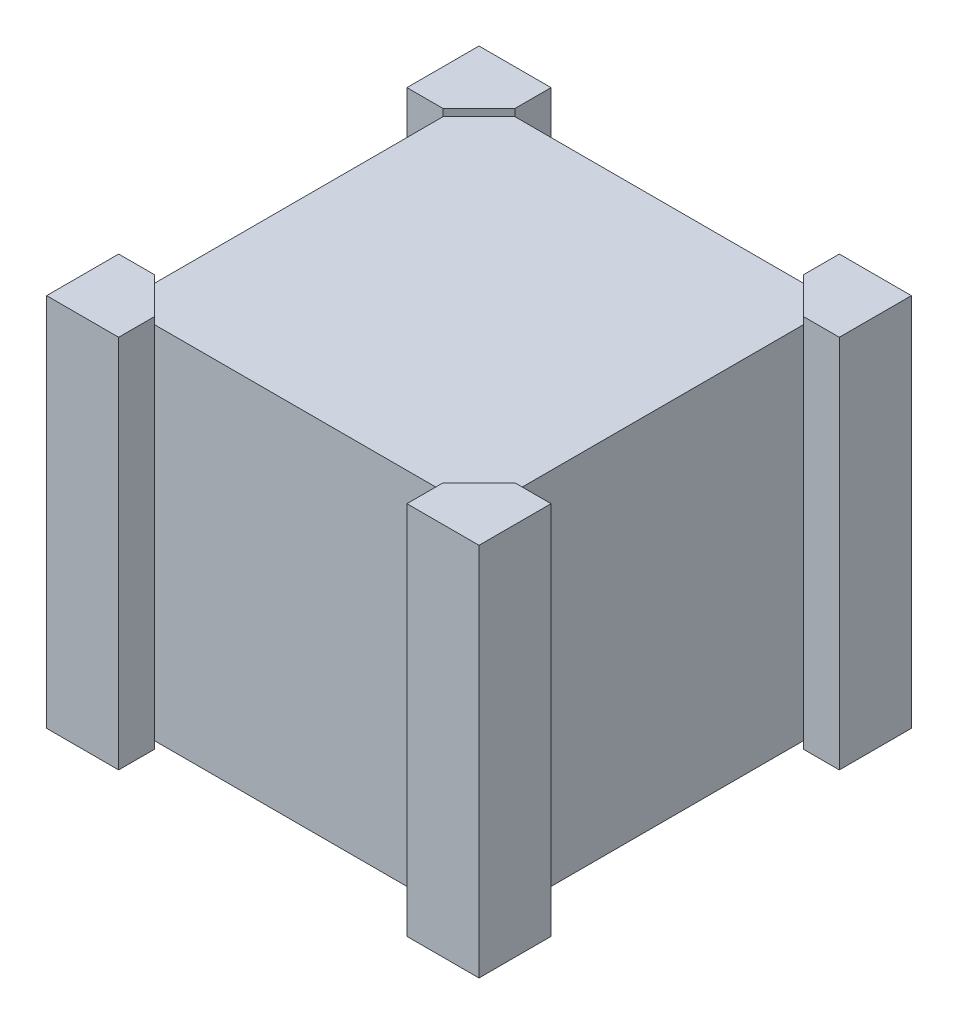
ISO-10303-21;
HEADER;
FILE_DESCRIPTION(('STEP AP214'),'2;1');
FILE_NAME('part.step','',(''),(''),'','','');
FILE_SCHEMA(('AUTOMOTIVE_DESIGN { 1 0 10303 214 1 1 1 1 }'));
ENDSEC;
DATA;
#1=APPLICATION_CONTEXT('core data for automotive mechanical design processes');
#2=APPLICATION_PROTOCOL_DEFINITION('international standard','automotive_design',2000,#1);
#3=PRODUCT_CONTEXT('',#1,'mechanical');
#4=PRODUCT('Part','Part','',(#3));
#5=PRODUCT_RELATED_PRODUCT_CATEGORY('part','',(#4));
#6=PRODUCT_DEFINITION_FORMATION('','',#4);
#7=PRODUCT_DEFINITION_CONTEXT('part definition',#1,'design');
#8=PRODUCT_DEFINITION('design','',#6,#7);
#9=PRODUCT_DEFINITION_SHAPE('','',#8);
#10=(LENGTH_UNIT() NAMED_UNIT(*) SI_UNIT(.MILLI.,.METRE.));
#11=(NAMED_UNIT(*) PLANE_ANGLE_UNIT() SI_UNIT($,.RADIAN.));
#12=(NAMED_UNIT(*) SI_UNIT($,.STERADIAN.) SOLID_ANGLE_UNIT());
#13=UNCERTAINTY_MEASURE_WITH_UNIT(LENGTH_MEASURE(1.E-05),#10,'distance_accuracy_value','');
#14=(GEOMETRIC_REPRESENTATION_CONTEXT(3) GLOBAL_UNCERTAINTY_ASSIGNED_CONTEXT((#13)) GLOBAL_UNIT_ASSIGNED_CONTEXT((#10,
#11,#12)) REPRESENTATION_CONTEXT('',''));
#15=CARTESIAN_POINT('',(0.,0.,0.));
#16=DIRECTION('',(0.,0.,1.));
#17=DIRECTION('',(1.,0.,0.));
#18=AXIS2_PLACEMENT_3D('',#15,#16,#17);
#19=CARTESIAN_POINT('',(0.,127.,0.));
#20=DIRECTION('',(0.,1.,0.));
#21=DIRECTION('',(0.,0.,1.));
#22=AXIS2_PLACEMENT_3D('',#19,#20,#21);
#23=PLANE('',#22);
#24=DIRECTION('',(0.707106781186549,0.,0.707106781186546));
#25=VECTOR('',#24,1.);
#26=CARTESIAN_POINT('',(-57.1499999999998,127.,57.1500000000001));
#27=LINE('',#26,#25);
#28=CARTESIAN_POINT('',(-63.5,127.,50.8));
#29=VERTEX_POINT('',#28);
#30=CARTESIAN_POINT('',(-50.8,127.,63.5));
#31=VERTEX_POINT('',#30);
#32=EDGE_CURVE('E268',#29,#31,#27,.T.);
#33=ORIENTED_EDGE('',*,*,#32,.T.);
#34=DIRECTION('',(1.,0.,0.));
#35=VECTOR('',#34,1.);
#36=CARTESIAN_POINT('',(0.,127.,63.5));
#37=LINE('',#36,#35);
#38=CARTESIAN_POINT('',(50.8,127.,63.5));
#39=VERTEX_POINT('',#38);
#40=EDGE_CURVE('E510',#31,#39,#37,.T.);
#41=ORIENTED_EDGE('',*,*,#40,.T.);
#42=DIRECTION('',(0.707106781186548,0.,-0.707106781186547));
#43=VECTOR('',#42,1.);
#44=CARTESIAN_POINT('',(57.15,127.,57.1500000000001));
#45=LINE('',#44,#43);
#46=CARTESIAN_POINT('',(63.5,127.,50.8));
#47=VERTEX_POINT('',#46);
#48=EDGE_CURVE('E355',#39,#47,#45,.T.);
#49=ORIENTED_EDGE('',*,*,#48,.T.);
#50=DIRECTION('',(0.,0.,1.));
#51=VECTOR('',#50,1.);
#52=CARTESIAN_POINT('',(63.5,127.,0.));
#53=LINE('',#52,#51);
#54=CARTESIAN_POINT('',(63.5,127.,-50.8));
#55=VERTEX_POINT('',#54);
#56=EDGE_CURVE('E499',#55,#47,#53,.T.);
#57=ORIENTED_EDGE('',*,*,#56,.F.);
#58=DIRECTION('',(-0.707106781186546,0.,-0.707106781186549));
#59=VECTOR('',#58,1.);
#60=CARTESIAN_POINT('',(57.1500000000002,127.,-57.1499999999998));
#61=LINE('',#60,#59);
#62=CARTESIAN_POINT('',(50.8,127.,-63.5));
#63=VERTEX_POINT('',#62);
#64=EDGE_CURVE('E323',#55,#63,#61,.T.);
#65=ORIENTED_EDGE('',*,*,#64,.T.);
#66=DIRECTION('',(1.,0.,0.));
#67=VECTOR('',#66,1.);
#68=CARTESIAN_POINT('',(0.,127.,-63.5));
#69=LINE('',#68,#67);
#70=CARTESIAN_POINT('',(-50.8,127.,-63.5));
#71=VERTEX_POINT('',#70);
#72=EDGE_CURVE('E502',#71,#63,#69,.T.);
#73=ORIENTED_EDGE('',*,*,#72,.F.);
#74=DIRECTION('',(0.707106781186548,0.,-0.707106781186547));
#75=VECTOR('',#74,1.);
#76=CARTESIAN_POINT('',(-57.15,127.,-57.15));
#77=LINE('',#76,#75);
#78=CARTESIAN_POINT('',(-63.5,127.,-50.8));
#79=VERTEX_POINT('',#78);
#80=EDGE_CURVE('E292',#79,#71,#77,.T.);
#81=ORIENTED_EDGE('',*,*,#80,.F.);
#82=DIRECTION('',(0.,0.,1.));
#83=VECTOR('',#82,1.);
#84=CARTESIAN_POINT('',(-63.5,127.,0.));
#85=LINE('',#84,#83);
#86=EDGE_CURVE('E506',#79,#29,#85,.T.);
#87=ORIENTED_EDGE('',*,*,#86,.T.);
#88=EDGE_LOOP('',(#33,#41,#49,#57,#65,#73,#81,#87));
#89=FACE_BOUND('',#88,.T.);
#90=ADVANCED_FACE('F45',(#89),#23,.T.);
#91=CARTESIAN_POINT('',(0.,0.,0.));
#92=DIRECTION('',(0.,1.,0.));
#93=DIRECTION('',(0.,0.,1.));
#94=AXIS2_PLACEMENT_3D('',#91,#92,#93);
#95=PLANE('',#94);
#96=DIRECTION('',(0.707106781186549,0.,0.707106781186546));
#97=VECTOR('',#96,1.);
#98=CARTESIAN_POINT('',(-57.1499999999998,0.,57.1500000000001));
#99=LINE('',#98,#97);
#100=CARTESIAN_POINT('',(-63.5,0.,50.8));
#101=VERTEX_POINT('',#100);
#102=CARTESIAN_POINT('',(-50.8,0.,63.5));
#103=VERTEX_POINT('',#102);
#104=EDGE_CURVE('E382',#101,#103,#99,.T.);
#105=ORIENTED_EDGE('',*,*,#104,.F.);
#106=DIRECTION('',(0.,0.,1.));
#107=VECTOR('',#106,1.);
#108=CARTESIAN_POINT('',(-63.5,0.,0.));
#109=LINE('',#108,#107);
#110=CARTESIAN_POINT('',(-63.5,0.,-50.8));
#111=VERTEX_POINT('',#110);
#112=EDGE_CURVE('E521',#111,#101,#109,.T.);
#113=ORIENTED_EDGE('',*,*,#112,.F.);
#114=DIRECTION('',(0.707106781186548,0.,-0.707106781186547));
#115=VECTOR('',#114,1.);
#116=CARTESIAN_POINT('',(-57.15,0.,-57.15));
#117=LINE('',#116,#115);
#118=CARTESIAN_POINT('',(-50.8,0.,-63.5));
#119=VERTEX_POINT('',#118);
#120=EDGE_CURVE('E410',#111,#119,#117,.T.);
#121=ORIENTED_EDGE('',*,*,#120,.T.);
#122=DIRECTION('',(1.,0.,0.));
#123=VECTOR('',#122,1.);
#124=CARTESIAN_POINT('',(0.,0.,-63.5));
#125=LINE('',#124,#123);
#126=CARTESIAN_POINT('',(50.8,0.,-63.5));
#127=VERTEX_POINT('',#126);
#128=EDGE_CURVE('E517',#119,#127,#125,.T.);
#129=ORIENTED_EDGE('',*,*,#128,.T.);
#130=DIRECTION('',(-0.707106781186546,0.,-0.707106781186549));
#131=VECTOR('',#130,1.);
#132=CARTESIAN_POINT('',(57.1500000000002,0.,-57.1499999999998));
#133=LINE('',#132,#131);
#134=CARTESIAN_POINT('',(63.5,0.,-50.8));
#135=VERTEX_POINT('',#134);
#136=EDGE_CURVE('E440',#135,#127,#133,.T.);
#137=ORIENTED_EDGE('',*,*,#136,.F.);
#138=DIRECTION('',(0.,0.,1.));
#139=VECTOR('',#138,1.);
#140=CARTESIAN_POINT('',(63.5,0.,0.));
#141=LINE('',#140,#139);
#142=CARTESIAN_POINT('',(63.5,0.,50.8));
#143=VERTEX_POINT('',#142);
#144=EDGE_CURVE('E498',#135,#143,#141,.T.);
#145=ORIENTED_EDGE('',*,*,#144,.T.);
#146=DIRECTION('',(0.707106781186548,0.,-0.707106781186547));
#147=VECTOR('',#146,1.);
#148=CARTESIAN_POINT('',(57.15,0.,57.1500000000001));
#149=LINE('',#148,#147);
#150=CARTESIAN_POINT('',(50.8,0.,63.5));
#151=VERTEX_POINT('',#150);
#152=EDGE_CURVE('E91',#151,#143,#149,.T.);
#153=ORIENTED_EDGE('',*,*,#152,.F.);
#154=DIRECTION('',(1.,0.,0.));
#155=VECTOR('',#154,1.);
#156=CARTESIAN_POINT('',(0.,0.,63.5));
#157=LINE('',#156,#155);
#158=EDGE_CURVE('E503',#103,#151,#157,.T.);
#159=ORIENTED_EDGE('',*,*,#158,.F.);
#160=EDGE_LOOP('',(#105,#113,#121,#129,#137,#145,#153,#159));
#161=FACE_BOUND('',#160,.T.);
#162=ADVANCED_FACE('F595',(#161),#95,.F.);
#163=CARTESIAN_POINT('',(63.5,127.,0.));
#164=DIRECTION('',(1.,0.,0.));
#165=DIRECTION('',(0.,0.,-1.));
#166=AXIS2_PLACEMENT_3D('',#163,#164,#165);
#167=PLANE('',#166);
#168=ORIENTED_EDGE('',*,*,#144,.F.);
#169=DIRECTION('',(0.,-1.,0.));
#170=VECTOR('',#169,1.);
#171=CARTESIAN_POINT('',(63.5,127.,-50.8));
#172=LINE('',#171,#170);
#173=EDGE_CURVE('E11',#55,#135,#172,.T.);
#174=ORIENTED_EDGE('',*,*,#173,.F.);
#175=ORIENTED_EDGE('',*,*,#56,.T.);
#176=DIRECTION('',(0.,-1.,0.));
#177=VECTOR('',#176,1.);
#178=CARTESIAN_POINT('',(63.5,127.,50.8));
#179=LINE('',#178,#177);
#180=EDGE_CURVE('E514',#47,#143,#179,.T.);
#181=ORIENTED_EDGE('',*,*,#180,.T.);
#182=EDGE_LOOP('',(#168,#174,#175,#181));
#183=FACE_BOUND('',#182,.T.);
#184=ADVANCED_FACE('F47',(#183),#167,.T.);
#185=CARTESIAN_POINT('',(0.,127.,-50.8));
#186=DIRECTION('',(0.,0.,-1.));
#187=DIRECTION('',(-1.,0.,0.));
#188=AXIS2_PLACEMENT_3D('',#185,#186,#187);
#189=PLANE('',#188);
#190=ORIENTED_EDGE('',*,*,#173,.T.);
#191=DIRECTION('',(0.,1.,0.));
#192=VECTOR('',#191,1.);
#193=CARTESIAN_POINT('',(63.5,-2.54,-50.8));
#194=LINE('',#193,#192);
#195=CARTESIAN_POINT('',(63.5,-2.54,-50.8));
#196=VERTEX_POINT('',#195);
#197=EDGE_CURVE('E466',#196,#135,#194,.T.);
#198=ORIENTED_EDGE('',*,*,#197,.F.);
#199=DIRECTION('',(-1.,0.,0.));
#200=VECTOR('',#199,1.);
#201=CARTESIAN_POINT('',(0.,-2.54,-50.8));
#202=LINE('',#201,#200);
#203=CARTESIAN_POINT('',(76.2,-2.54,-50.8));
#204=VERTEX_POINT('',#203);
#205=EDGE_CURVE('E441',#204,#196,#202,.T.);
#206=ORIENTED_EDGE('',*,*,#205,.F.);
#207=DIRECTION('',(0.,-1.,0.));
#208=VECTOR('',#207,1.);
#209=CARTESIAN_POINT('',(76.2,127.,-50.8));
#210=LINE('',#209,#208);
#211=CARTESIAN_POINT('',(76.2,129.54,-50.8));
#212=VERTEX_POINT('',#211);
#213=EDGE_CURVE('E55',#212,#204,#210,.T.);
#214=ORIENTED_EDGE('',*,*,#213,.F.);
#215=DIRECTION('',(-1.,0.,0.));
#216=VECTOR('',#215,1.);
#217=CARTESIAN_POINT('',(0.,129.54,-50.8));
#218=LINE('',#217,#216);
#219=CARTESIAN_POINT('',(63.5,129.54,-50.8));
#220=VERTEX_POINT('',#219);
#221=EDGE_CURVE('E324',#212,#220,#218,.T.);
#222=ORIENTED_EDGE('',*,*,#221,.T.);
#223=DIRECTION('',(0.,-1.,0.));
#224=VECTOR('',#223,1.);
#225=CARTESIAN_POINT('',(63.5,129.54,-50.8));
#226=LINE('',#225,#224);
#227=EDGE_CURVE('E344',#220,#55,#226,.T.);
#228=ORIENTED_EDGE('',*,*,#227,.T.);
#229=EDGE_LOOP('',(#190,#198,#206,#214,#222,#228));
#230=FACE_BOUND('',#229,.T.);
#231=ADVANCED_FACE('F590',(#230),#189,.F.);
#232=CARTESIAN_POINT('',(76.2,127.,0.));
#233=DIRECTION('',(1.,0.,0.));
#234=DIRECTION('',(0.,0.,-1.));
#235=AXIS2_PLACEMENT_3D('',#232,#233,#234);
#236=PLANE('',#235);
#237=ORIENTED_EDGE('',*,*,#213,.T.);
#238=DIRECTION('',(0.,0.,1.));
#239=VECTOR('',#238,1.);
#240=CARTESIAN_POINT('',(76.2,-2.54,0.));
#241=LINE('',#240,#239);
#242=CARTESIAN_POINT('',(76.2,-2.54,-76.2));
#243=VERTEX_POINT('',#242);
#244=EDGE_CURVE('E456',#243,#204,#241,.T.);
#245=ORIENTED_EDGE('',*,*,#244,.F.);
#246=DIRECTION('',(0.,-1.,0.));
#247=VECTOR('',#246,1.);
#248=CARTESIAN_POINT('',(76.2,127.,-76.2));
#249=LINE('',#248,#247);
#250=CARTESIAN_POINT('',(76.2,129.54,-76.2));
#251=VERTEX_POINT('',#250);
#252=EDGE_CURVE('E576',#251,#243,#249,.T.);
#253=ORIENTED_EDGE('',*,*,#252,.F.);
#254=DIRECTION('',(0.,0.,1.));
#255=VECTOR('',#254,1.);
#256=CARTESIAN_POINT('',(76.2,129.54,0.));
#257=LINE('',#256,#255);
#258=EDGE_CURVE('E328',#251,#212,#257,.T.);
#259=ORIENTED_EDGE('',*,*,#258,.T.);
#260=EDGE_LOOP('',(#237,#245,#253,#259));
#261=FACE_BOUND('',#260,.T.);
#262=ADVANCED_FACE('F581',(#261),#236,.T.);
#263=CARTESIAN_POINT('',(0.,127.,-76.2));
#264=DIRECTION('',(0.,0.,-1.));
#265=DIRECTION('',(-1.,0.,0.));
#266=AXIS2_PLACEMENT_3D('',#263,#264,#265);
#267=PLANE('',#266);
#268=ORIENTED_EDGE('',*,*,#252,.T.);
#269=DIRECTION('',(1.,0.,0.));
#270=VECTOR('',#269,1.);
#271=CARTESIAN_POINT('',(0.,-2.54,-76.2));
#272=LINE('',#271,#270);
#273=CARTESIAN_POINT('',(50.8,-2.54,-76.2));
#274=VERTEX_POINT('',#273);
#275=EDGE_CURVE('E452',#274,#243,#272,.T.);
#276=ORIENTED_EDGE('',*,*,#275,.F.);
#277=DIRECTION('',(0.,-1.,0.));
#278=VECTOR('',#277,1.);
#279=CARTESIAN_POINT('',(50.8,127.,-76.2));
#280=LINE('',#279,#278);
#281=CARTESIAN_POINT('',(50.8,129.54,-76.2));
#282=VERTEX_POINT('',#281);
#283=EDGE_CURVE('E573',#282,#274,#280,.T.);
#284=ORIENTED_EDGE('',*,*,#283,.F.);
#285=DIRECTION('',(1.,0.,0.));
#286=VECTOR('',#285,1.);
#287=CARTESIAN_POINT('',(0.,129.54,-76.2));
#288=LINE('',#287,#286);
#289=EDGE_CURVE('E332',#282,#251,#288,.T.);
#290=ORIENTED_EDGE('',*,*,#289,.T.);
#291=EDGE_LOOP('',(#268,#276,#284,#290));
#292=FACE_BOUND('',#291,.T.);
#293=ADVANCED_FACE('F616',(#292),#267,.T.);
#294=CARTESIAN_POINT('',(50.8,127.,0.));
#295=DIRECTION('',(1.,0.,0.));
#296=DIRECTION('',(0.,0.,-1.));
#297=AXIS2_PLACEMENT_3D('',#294,#295,#296);
#298=PLANE('',#297);
#299=ORIENTED_EDGE('',*,*,#283,.T.);
#300=DIRECTION('',(0.,0.,-1.));
#301=VECTOR('',#300,1.);
#302=CARTESIAN_POINT('',(50.8,-2.54,0.));
#303=LINE('',#302,#301);
#304=CARTESIAN_POINT('',(50.8,-2.54,-63.5));
#305=VERTEX_POINT('',#304);
#306=EDGE_CURVE('E448',#305,#274,#303,.T.);
#307=ORIENTED_EDGE('',*,*,#306,.F.);
#308=DIRECTION('',(0.,1.,0.));
#309=VECTOR('',#308,1.);
#310=CARTESIAN_POINT('',(50.8,-2.54,-63.5));
#311=LINE('',#310,#309);
#312=EDGE_CURVE('E460',#305,#127,#311,.T.);
#313=ORIENTED_EDGE('',*,*,#312,.T.);
#314=DIRECTION('',(0.,-1.,0.));
#315=VECTOR('',#314,1.);
#316=CARTESIAN_POINT('',(50.8,127.,-63.5));
#317=LINE('',#316,#315);
#318=EDGE_CURVE('E569',#63,#127,#317,.T.);
#319=ORIENTED_EDGE('',*,*,#318,.F.);
#320=DIRECTION('',(0.,-1.,0.));
#321=VECTOR('',#320,1.);
#322=CARTESIAN_POINT('',(50.8,129.54,-63.5));
#323=LINE('',#322,#321);
#324=CARTESIAN_POINT('',(50.8,129.54,-63.5));
#325=VERTEX_POINT('',#324);
#326=EDGE_CURVE('E351',#325,#63,#323,.T.);
#327=ORIENTED_EDGE('',*,*,#326,.F.);
#328=DIRECTION('',(0.,0.,-1.));
#329=VECTOR('',#328,1.);
#330=CARTESIAN_POINT('',(50.8,129.54,0.));
#331=LINE('',#330,#329);
#332=EDGE_CURVE('E336',#325,#282,#331,.T.);
#333=ORIENTED_EDGE('',*,*,#332,.T.);
#334=EDGE_LOOP('',(#299,#307,#313,#319,#327,#333));
#335=FACE_BOUND('',#334,.T.);
#336=ADVANCED_FACE('F603',(#335),#298,.F.);
#337=CARTESIAN_POINT('',(0.,127.,-63.5));
#338=DIRECTION('',(0.,0.,-1.));
#339=DIRECTION('',(-1.,0.,0.));
#340=AXIS2_PLACEMENT_3D('',#337,#338,#339);
#341=PLANE('',#340);
#342=ORIENTED_EDGE('',*,*,#128,.F.);
#343=DIRECTION('',(0.,-1.,0.));
#344=VECTOR('',#343,1.);
#345=CARTESIAN_POINT('',(-50.8,127.,-63.5));
#346=LINE('',#345,#344);
#347=EDGE_CURVE('E565',#71,#119,#346,.T.);
#348=ORIENTED_EDGE('',*,*,#347,.F.);
#349=ORIENTED_EDGE('',*,*,#72,.T.);
#350=ORIENTED_EDGE('',*,*,#318,.T.);
#351=EDGE_LOOP('',(#342,#348,#349,#350));
#352=FACE_BOUND('',#351,.T.);
#353=ADVANCED_FACE('F599',(#352),#341,.T.);
#354=CARTESIAN_POINT('',(-50.8,127.,0.));
#355=DIRECTION('',(1.,0.,0.));
#356=DIRECTION('',(0.,0.,-1.));
#357=AXIS2_PLACEMENT_3D('',#354,#355,#356);
#358=PLANE('',#357);
#359=ORIENTED_EDGE('',*,*,#347,.T.);
#360=DIRECTION('',(0.,1.,0.));
#361=VECTOR('',#360,1.);
#362=CARTESIAN_POINT('',(-50.8,-2.54,-63.5));
#363=LINE('',#362,#361);
#364=CARTESIAN_POINT('',(-50.8,-2.54,-63.5));
#365=VERTEX_POINT('',#364);
#366=EDGE_CURVE('E430',#365,#119,#363,.T.);
#367=ORIENTED_EDGE('',*,*,#366,.F.);
#368=DIRECTION('',(0.,0.,1.));
#369=VECTOR('',#368,1.);
#370=CARTESIAN_POINT('',(-50.8,-2.54,0.));
#371=LINE('',#370,#369);
#372=CARTESIAN_POINT('',(-50.8,-2.54,-76.2));
#373=VERTEX_POINT('',#372);
#374=EDGE_CURVE('E427',#373,#365,#371,.T.);
#375=ORIENTED_EDGE('',*,*,#374,.F.);
#376=DIRECTION('',(0.,-1.,0.));
#377=VECTOR('',#376,1.);
#378=CARTESIAN_POINT('',(-50.8,127.,-76.2));
#379=LINE('',#378,#377);
#380=CARTESIAN_POINT('',(-50.8,129.54,-76.2));
#381=VERTEX_POINT('',#380);
#382=EDGE_CURVE('E562',#381,#373,#379,.T.);
#383=ORIENTED_EDGE('',*,*,#382,.F.);
#384=DIRECTION('',(0.,0.,1.));
#385=VECTOR('',#384,1.);
#386=CARTESIAN_POINT('',(-50.8,129.54,0.));
#387=LINE('',#386,#385);
#388=CARTESIAN_POINT('',(-50.8,129.54,-63.5));
#389=VERTEX_POINT('',#388);
#390=EDGE_CURVE('E296',#381,#389,#387,.T.);
#391=ORIENTED_EDGE('',*,*,#390,.T.);
#392=DIRECTION('',(0.,-1.,0.));
#393=VECTOR('',#392,1.);
#394=CARTESIAN_POINT('',(-50.8,129.54,-63.5));
#395=LINE('',#394,#393);
#396=EDGE_CURVE('E319',#389,#71,#395,.T.);
#397=ORIENTED_EDGE('',*,*,#396,.T.);
#398=EDGE_LOOP('',(#359,#367,#375,#383,#391,#397));
#399=FACE_BOUND('',#398,.T.);
#400=ADVANCED_FACE('F681',(#399),#358,.T.);
#401=CARTESIAN_POINT('',(0.,127.,-76.2));
#402=DIRECTION('',(0.,0.,-1.));
#403=DIRECTION('',(-1.,0.,0.));
#404=AXIS2_PLACEMENT_3D('',#401,#402,#403);
#405=PLANE('',#404);
#406=ORIENTED_EDGE('',*,*,#382,.T.);
#407=DIRECTION('',(1.,0.,0.));
#408=VECTOR('',#407,1.);
#409=CARTESIAN_POINT('',(0.,-2.54,-76.2));
#410=LINE('',#409,#408);
#411=CARTESIAN_POINT('',(-76.2,-2.54,-76.2));
#412=VERTEX_POINT('',#411);
#413=EDGE_CURVE('E423',#412,#373,#410,.T.);
#414=ORIENTED_EDGE('',*,*,#413,.F.);
#415=DIRECTION('',(0.,-1.,0.));
#416=VECTOR('',#415,1.);
#417=CARTESIAN_POINT('',(-76.2,127.,-76.2));
#418=LINE('',#417,#416);
#419=CARTESIAN_POINT('',(-76.2,129.54,-76.2));
#420=VERTEX_POINT('',#419);
#421=EDGE_CURVE('E559',#420,#412,#418,.T.);
#422=ORIENTED_EDGE('',*,*,#421,.F.);
#423=DIRECTION('',(1.,0.,0.));
#424=VECTOR('',#423,1.);
#425=CARTESIAN_POINT('',(0.,129.54,-76.2));
#426=LINE('',#425,#424);
#427=EDGE_CURVE('E300',#420,#381,#426,.T.);
#428=ORIENTED_EDGE('',*,*,#427,.T.);
#429=EDGE_LOOP('',(#406,#414,#422,#428));
#430=FACE_BOUND('',#429,.T.);
#431=ADVANCED_FACE('F677',(#430),#405,.T.);
#432=CARTESIAN_POINT('',(-76.2,127.,0.));
#433=DIRECTION('',(1.,0.,0.));
#434=DIRECTION('',(0.,0.,-1.));
#435=AXIS2_PLACEMENT_3D('',#432,#433,#434);
#436=PLANE('',#435);
#437=ORIENTED_EDGE('',*,*,#421,.T.);
#438=DIRECTION('',(0.,0.,-1.));
#439=VECTOR('',#438,1.);
#440=CARTESIAN_POINT('',(-76.2,-2.54,0.));
#441=LINE('',#440,#439);
#442=CARTESIAN_POINT('',(-76.2,-2.54,-50.8));
#443=VERTEX_POINT('',#442);
#444=EDGE_CURVE('E419',#443,#412,#441,.T.);
#445=ORIENTED_EDGE('',*,*,#444,.F.);
#446=DIRECTION('',(0.,-1.,0.));
#447=VECTOR('',#446,1.);
#448=CARTESIAN_POINT('',(-76.2,127.,-50.8));
#449=LINE('',#448,#447);
#450=CARTESIAN_POINT('',(-76.2,129.54,-50.8));
#451=VERTEX_POINT('',#450);
#452=EDGE_CURVE('E556',#451,#443,#449,.T.);
#453=ORIENTED_EDGE('',*,*,#452,.F.);
#454=DIRECTION('',(0.,0.,-1.));
#455=VECTOR('',#454,1.);
#456=CARTESIAN_POINT('',(-76.2,129.54,0.));
#457=LINE('',#456,#455);
#458=EDGE_CURVE('E304',#451,#420,#457,.T.);
#459=ORIENTED_EDGE('',*,*,#458,.T.);
#460=EDGE_LOOP('',(#437,#445,#453,#459));
#461=FACE_BOUND('',#460,.T.);
#462=ADVANCED_FACE('F673',(#461),#436,.F.);
#463=CARTESIAN_POINT('',(0.,127.,-50.8));
#464=DIRECTION('',(0.,0.,-1.));
#465=DIRECTION('',(-1.,0.,0.));
#466=AXIS2_PLACEMENT_3D('',#463,#464,#465);
#467=PLANE('',#466);
#468=ORIENTED_EDGE('',*,*,#452,.T.);
#469=DIRECTION('',(-1.,0.,0.));
#470=VECTOR('',#469,1.);
#471=CARTESIAN_POINT('',(0.,-2.54,-50.8));
#472=LINE('',#471,#470);
#473=CARTESIAN_POINT('',(-63.5,-2.54,-50.8));
#474=VERTEX_POINT('',#473);
#475=EDGE_CURVE('E415',#474,#443,#472,.T.);
#476=ORIENTED_EDGE('',*,*,#475,.F.);
#477=DIRECTION('',(0.,1.,0.));
#478=VECTOR('',#477,1.);
#479=CARTESIAN_POINT('',(-63.5,-2.54,-50.8));
#480=LINE('',#479,#478);
#481=EDGE_CURVE('E436',#474,#111,#480,.T.);
#482=ORIENTED_EDGE('',*,*,#481,.T.);
#483=DIRECTION('',(0.,-1.,0.));
#484=VECTOR('',#483,1.);
#485=CARTESIAN_POINT('',(-63.5,127.,-50.8));
#486=LINE('',#485,#484);
#487=EDGE_CURVE('E552',#79,#111,#486,.T.);
#488=ORIENTED_EDGE('',*,*,#487,.F.);
#489=DIRECTION('',(0.,-1.,0.));
#490=VECTOR('',#489,1.);
#491=CARTESIAN_POINT('',(-63.5,129.54,-50.8));
#492=LINE('',#491,#490);
#493=CARTESIAN_POINT('',(-63.5,129.54,-50.8));
#494=VERTEX_POINT('',#493);
#495=EDGE_CURVE('E312',#494,#79,#492,.T.);
#496=ORIENTED_EDGE('',*,*,#495,.F.);
#497=DIRECTION('',(-1.,0.,0.));
#498=VECTOR('',#497,1.);
#499=CARTESIAN_POINT('',(0.,129.54,-50.8));
#500=LINE('',#499,#498);
#501=EDGE_CURVE('E308',#494,#451,#500,.T.);
#502=ORIENTED_EDGE('',*,*,#501,.T.);
#503=EDGE_LOOP('',(#468,#476,#482,#488,#496,#502));
#504=FACE_BOUND('',#503,.T.);
#505=ADVANCED_FACE('F669',(#504),#467,.F.);
#506=CARTESIAN_POINT('',(-63.5,127.,0.));
#507=DIRECTION('',(1.,0.,0.));
#508=DIRECTION('',(0.,0.,-1.));
#509=AXIS2_PLACEMENT_3D('',#506,#507,#508);
#510=PLANE('',#509);
#511=ORIENTED_EDGE('',*,*,#112,.T.);
#512=DIRECTION('',(0.,-1.,0.));
#513=VECTOR('',#512,1.);
#514=CARTESIAN_POINT('',(-63.5,127.,50.8));
#515=LINE('',#514,#513);
#516=EDGE_CURVE('E255',#29,#101,#515,.T.);
#517=ORIENTED_EDGE('',*,*,#516,.F.);
#518=ORIENTED_EDGE('',*,*,#86,.F.);
#519=ORIENTED_EDGE('',*,*,#487,.T.);
#520=EDGE_LOOP('',(#511,#517,#518,#519));
#521=FACE_BOUND('',#520,.T.);
#522=ADVANCED_FACE('F666',(#521),#510,.F.);
#523=CARTESIAN_POINT('',(0.,127.,50.8));
#524=DIRECTION('',(0.,0.,-1.));
#525=DIRECTION('',(-1.,0.,0.));
#526=AXIS2_PLACEMENT_3D('',#523,#524,#525);
#527=PLANE('',#526);
#528=ORIENTED_EDGE('',*,*,#516,.T.);
#529=DIRECTION('',(0.,1.,0.));
#530=VECTOR('',#529,1.);
#531=CARTESIAN_POINT('',(-63.5,-2.54,50.8));
#532=LINE('',#531,#530);
#533=CARTESIAN_POINT('',(-63.5,-2.54,50.8));
#534=VERTEX_POINT('',#533);
#535=EDGE_CURVE('E406',#534,#101,#532,.T.);
#536=ORIENTED_EDGE('',*,*,#535,.F.);
#537=DIRECTION('',(1.,0.,0.));
#538=VECTOR('',#537,1.);
#539=CARTESIAN_POINT('',(0.,-2.54,50.8));
#540=LINE('',#539,#538);
#541=CARTESIAN_POINT('',(-76.2,-2.54,50.8));
#542=VERTEX_POINT('',#541);
#543=EDGE_CURVE('E249',#542,#534,#540,.T.);
#544=ORIENTED_EDGE('',*,*,#543,.F.);
#545=DIRECTION('',(0.,-1.,0.));
#546=VECTOR('',#545,1.);
#547=CARTESIAN_POINT('',(-76.2,127.,50.8));
#548=LINE('',#547,#546);
#549=CARTESIAN_POINT('',(-76.2,129.54,50.8));
#550=VERTEX_POINT('',#549);
#551=EDGE_CURVE('E241',#550,#542,#548,.T.);
#552=ORIENTED_EDGE('',*,*,#551,.F.);
#553=DIRECTION('',(1.,0.,0.));
#554=VECTOR('',#553,1.);
#555=CARTESIAN_POINT('',(0.,129.54,50.8));
#556=LINE('',#555,#554);
#557=CARTESIAN_POINT('',(-63.5,129.54,50.8));
#558=VERTEX_POINT('',#557);
#559=EDGE_CURVE('E245',#550,#558,#556,.T.);
#560=ORIENTED_EDGE('',*,*,#559,.T.);
#561=DIRECTION('',(0.,-1.,0.));
#562=VECTOR('',#561,1.);
#563=CARTESIAN_POINT('',(-63.5,129.54,50.8));
#564=LINE('',#563,#562);
#565=EDGE_CURVE('E283',#558,#29,#564,.T.);
#566=ORIENTED_EDGE('',*,*,#565,.T.);
#567=EDGE_LOOP('',(#528,#536,#544,#552,#560,#566));
#568=FACE_BOUND('',#567,.T.);
#569=ADVANCED_FACE('F244',(#568),#527,.T.);
#570=CARTESIAN_POINT('',(-76.2,127.,0.));
#571=DIRECTION('',(1.,0.,0.));
#572=DIRECTION('',(0.,0.,-1.));
#573=AXIS2_PLACEMENT_3D('',#570,#571,#572);
#574=PLANE('',#573);
#575=ORIENTED_EDGE('',*,*,#551,.T.);
#576=DIRECTION('',(0.,0.,-1.));
#577=VECTOR('',#576,1.);
#578=CARTESIAN_POINT('',(-76.2,-2.54,0.));
#579=LINE('',#578,#577);
#580=CARTESIAN_POINT('',(-76.2,-2.54,76.2));
#581=VERTEX_POINT('',#580);
#582=EDGE_CURVE('E396',#581,#542,#579,.T.);
#583=ORIENTED_EDGE('',*,*,#582,.F.);
#584=DIRECTION('',(0.,-1.,0.));
#585=VECTOR('',#584,1.);
#586=CARTESIAN_POINT('',(-76.2,127.,76.2));
#587=LINE('',#586,#585);
#588=CARTESIAN_POINT('',(-76.2,129.54,76.2));
#589=VERTEX_POINT('',#588);
#590=EDGE_CURVE('E256',#589,#581,#587,.T.);
#591=ORIENTED_EDGE('',*,*,#590,.F.);
#592=DIRECTION('',(0.,0.,-1.));
#593=VECTOR('',#592,1.);
#594=CARTESIAN_POINT('',(-76.2,129.54,0.));
#595=LINE('',#594,#593);
#596=EDGE_CURVE('E262',#589,#550,#595,.T.);
#597=ORIENTED_EDGE('',*,*,#596,.T.);
#598=EDGE_LOOP('',(#575,#583,#591,#597));
#599=FACE_BOUND('',#598,.T.);
#600=ADVANCED_FACE('F270',(#599),#574,.F.);
#601=CARTESIAN_POINT('',(0.,127.,76.2));
#602=DIRECTION('',(0.,0.,-1.));
#603=DIRECTION('',(-1.,0.,0.));
#604=AXIS2_PLACEMENT_3D('',#601,#602,#603);
#605=PLANE('',#604);
#606=ORIENTED_EDGE('',*,*,#590,.T.);
#607=DIRECTION('',(-1.,0.,0.));
#608=VECTOR('',#607,1.);
#609=CARTESIAN_POINT('',(0.,-2.54,76.2));
#610=LINE('',#609,#608);
#611=CARTESIAN_POINT('',(-50.8,-2.54,76.2));
#612=VERTEX_POINT('',#611);
#613=EDGE_CURVE('E392',#612,#581,#610,.T.);
#614=ORIENTED_EDGE('',*,*,#613,.F.);
#615=DIRECTION('',(0.,-1.,0.));
#616=VECTOR('',#615,1.);
#617=CARTESIAN_POINT('',(-50.8,127.,76.2));
#618=LINE('',#617,#616);
#619=CARTESIAN_POINT('',(-50.8,129.54,76.2));
#620=VERTEX_POINT('',#619);
#621=EDGE_CURVE('E545',#620,#612,#618,.T.);
#622=ORIENTED_EDGE('',*,*,#621,.F.);
#623=DIRECTION('',(-1.,0.,0.));
#624=VECTOR('',#623,1.);
#625=CARTESIAN_POINT('',(0.,129.54,76.2));
#626=LINE('',#625,#624);
#627=EDGE_CURVE('E272',#620,#589,#626,.T.);
#628=ORIENTED_EDGE('',*,*,#627,.T.);
#629=EDGE_LOOP('',(#606,#614,#622,#628));
#630=FACE_BOUND('',#629,.T.);
#631=ADVANCED_FACE('F657',(#630),#605,.F.);
#632=CARTESIAN_POINT('',(-50.8,127.,0.));
#633=DIRECTION('',(1.,0.,0.));
#634=DIRECTION('',(0.,0.,-1.));
#635=AXIS2_PLACEMENT_3D('',#632,#633,#634);
#636=PLANE('',#635);
#637=ORIENTED_EDGE('',*,*,#621,.T.);
#638=DIRECTION('',(0.,0.,1.));
#639=VECTOR('',#638,1.);
#640=CARTESIAN_POINT('',(-50.8,-2.54,0.));
#641=LINE('',#640,#639);
#642=CARTESIAN_POINT('',(-50.8,-2.54,63.5));
#643=VERTEX_POINT('',#642);
#644=EDGE_CURVE('E388',#643,#612,#641,.T.);
#645=ORIENTED_EDGE('',*,*,#644,.F.);
#646=DIRECTION('',(0.,1.,0.));
#647=VECTOR('',#646,1.);
#648=CARTESIAN_POINT('',(-50.8,-2.54,63.5));
#649=LINE('',#648,#647);
#650=EDGE_CURVE('E399',#643,#103,#649,.T.);
#651=ORIENTED_EDGE('',*,*,#650,.T.);
#652=DIRECTION('',(0.,-1.,0.));
#653=VECTOR('',#652,1.);
#654=CARTESIAN_POINT('',(-50.8,127.,63.5));
#655=LINE('',#654,#653);
#656=EDGE_CURVE('E85',#31,#103,#655,.T.);
#657=ORIENTED_EDGE('',*,*,#656,.F.);
#658=DIRECTION('',(0.,-1.,0.));
#659=VECTOR('',#658,1.);
#660=CARTESIAN_POINT('',(-50.8,129.54,63.5));
#661=LINE('',#660,#659);
#662=CARTESIAN_POINT('',(-50.8,129.54,63.5));
#663=VERTEX_POINT('',#662);
#664=EDGE_CURVE('E289',#663,#31,#661,.T.);
#665=ORIENTED_EDGE('',*,*,#664,.F.);
#666=DIRECTION('',(0.,0.,1.));
#667=VECTOR('',#666,1.);
#668=CARTESIAN_POINT('',(-50.8,129.54,0.));
#669=LINE('',#668,#667);
#670=EDGE_CURVE('E275',#663,#620,#669,.T.);
#671=ORIENTED_EDGE('',*,*,#670,.T.);
#672=EDGE_LOOP('',(#637,#645,#651,#657,#665,#671));
#673=FACE_BOUND('',#672,.T.);
#674=ADVANCED_FACE('F654',(#673),#636,.T.);
#675=CARTESIAN_POINT('',(0.,127.,63.5));
#676=DIRECTION('',(0.,0.,-1.));
#677=DIRECTION('',(-1.,0.,0.));
#678=AXIS2_PLACEMENT_3D('',#675,#676,#677);
#679=PLANE('',#678);
#680=ORIENTED_EDGE('',*,*,#158,.T.);
#681=DIRECTION('',(0.,-1.,0.));
#682=VECTOR('',#681,1.);
#683=CARTESIAN_POINT('',(50.8,127.,63.5));
#684=LINE('',#683,#682);
#685=EDGE_CURVE('E539',#39,#151,#684,.T.);
#686=ORIENTED_EDGE('',*,*,#685,.F.);
#687=ORIENTED_EDGE('',*,*,#40,.F.);
#688=ORIENTED_EDGE('',*,*,#656,.T.);
#689=EDGE_LOOP('',(#680,#686,#687,#688));
#690=FACE_BOUND('',#689,.T.);
#691=ADVANCED_FACE('F650',(#690),#679,.F.);
#692=CARTESIAN_POINT('',(50.8,127.,0.));
#693=DIRECTION('',(1.,0.,0.));
#694=DIRECTION('',(0.,0.,-1.));
#695=AXIS2_PLACEMENT_3D('',#692,#693,#694);
#696=PLANE('',#695);
#697=ORIENTED_EDGE('',*,*,#685,.T.);
#698=DIRECTION('',(0.,1.,0.));
#699=VECTOR('',#698,1.);
#700=CARTESIAN_POINT('',(50.8,-2.54,63.5));
#701=LINE('',#700,#699);
#702=CARTESIAN_POINT('',(50.8,-2.54,63.5));
#703=VERTEX_POINT('',#702);
#704=EDGE_CURVE('E494',#703,#151,#701,.T.);
#705=ORIENTED_EDGE('',*,*,#704,.F.);
#706=DIRECTION('',(0.,0.,-1.));
#707=VECTOR('',#706,1.);
#708=CARTESIAN_POINT('',(50.8,-2.54,0.));
#709=LINE('',#708,#707);
#710=CARTESIAN_POINT('',(50.8,-2.54,76.2));
#711=VERTEX_POINT('',#710);
#712=EDGE_CURVE('E469',#711,#703,#709,.T.);
#713=ORIENTED_EDGE('',*,*,#712,.F.);
#714=DIRECTION('',(0.,-1.,0.));
#715=VECTOR('',#714,1.);
#716=CARTESIAN_POINT('',(50.8,127.,76.2));
#717=LINE('',#716,#715);
#718=CARTESIAN_POINT('',(50.8,129.54,76.2));
#719=VERTEX_POINT('',#718);
#720=EDGE_CURVE('E536',#719,#711,#717,.T.);
#721=ORIENTED_EDGE('',*,*,#720,.F.);
#722=DIRECTION('',(0.,0.,-1.));
#723=VECTOR('',#722,1.);
#724=CARTESIAN_POINT('',(50.8,129.54,0.));
#725=LINE('',#724,#723);
#726=CARTESIAN_POINT('',(50.8,129.54,63.5));
#727=VERTEX_POINT('',#726);
#728=EDGE_CURVE('E356',#719,#727,#725,.T.);
#729=ORIENTED_EDGE('',*,*,#728,.T.);
#730=DIRECTION('',(0.,-1.,0.));
#731=VECTOR('',#730,1.);
#732=CARTESIAN_POINT('',(50.8,129.54,63.5));
#733=LINE('',#732,#731);
#734=EDGE_CURVE('E375',#727,#39,#733,.T.);
#735=ORIENTED_EDGE('',*,*,#734,.T.);
#736=EDGE_LOOP('',(#697,#705,#713,#721,#729,#735));
#737=FACE_BOUND('',#736,.T.);
#738=ADVANCED_FACE('F646',(#737),#696,.F.);
#739=CARTESIAN_POINT('',(0.,127.,76.2));
#740=DIRECTION('',(0.,0.,-1.));
#741=DIRECTION('',(-1.,0.,0.));
#742=AXIS2_PLACEMENT_3D('',#739,#740,#741);
#743=PLANE('',#742);
#744=ORIENTED_EDGE('',*,*,#720,.T.);
#745=DIRECTION('',(-1.,0.,0.));
#746=VECTOR('',#745,1.);
#747=CARTESIAN_POINT('',(0.,-2.54,76.2));
#748=LINE('',#747,#746);
#749=CARTESIAN_POINT('',(76.2,-2.54,76.2));
#750=VERTEX_POINT('',#749);
#751=EDGE_CURVE('E484',#750,#711,#748,.T.);
#752=ORIENTED_EDGE('',*,*,#751,.F.);
#753=DIRECTION('',(0.,-1.,0.));
#754=VECTOR('',#753,1.);
#755=CARTESIAN_POINT('',(76.2,127.,76.2));
#756=LINE('',#755,#754);
#757=CARTESIAN_POINT('',(76.2,129.54,76.2));
#758=VERTEX_POINT('',#757);
#759=EDGE_CURVE('E533',#758,#750,#756,.T.);
#760=ORIENTED_EDGE('',*,*,#759,.F.);
#761=DIRECTION('',(-1.,0.,0.));
#762=VECTOR('',#761,1.);
#763=CARTESIAN_POINT('',(0.,129.54,76.2));
#764=LINE('',#763,#762);
#765=EDGE_CURVE('E360',#758,#719,#764,.T.);
#766=ORIENTED_EDGE('',*,*,#765,.T.);
#767=EDGE_LOOP('',(#744,#752,#760,#766));
#768=FACE_BOUND('',#767,.T.);
#769=ADVANCED_FACE('F642',(#768),#743,.F.);
#770=CARTESIAN_POINT('',(76.2,127.,0.));
#771=DIRECTION('',(1.,0.,0.));
#772=DIRECTION('',(0.,0.,-1.));
#773=AXIS2_PLACEMENT_3D('',#770,#771,#772);
#774=PLANE('',#773);
#775=ORIENTED_EDGE('',*,*,#759,.T.);
#776=DIRECTION('',(0.,0.,1.));
#777=VECTOR('',#776,1.);
#778=CARTESIAN_POINT('',(76.2,-2.54,0.));
#779=LINE('',#778,#777);
#780=CARTESIAN_POINT('',(76.2,-2.54,50.8));
#781=VERTEX_POINT('',#780);
#782=EDGE_CURVE('E480',#781,#750,#779,.T.);
#783=ORIENTED_EDGE('',*,*,#782,.F.);
#784=DIRECTION('',(0.,-1.,0.));
#785=VECTOR('',#784,1.);
#786=CARTESIAN_POINT('',(76.2,127.,50.8));
#787=LINE('',#786,#785);
#788=CARTESIAN_POINT('',(76.2,129.54,50.8));
#789=VERTEX_POINT('',#788);
#790=EDGE_CURVE('E530',#789,#781,#787,.T.);
#791=ORIENTED_EDGE('',*,*,#790,.F.);
#792=DIRECTION('',(0.,0.,1.));
#793=VECTOR('',#792,1.);
#794=CARTESIAN_POINT('',(76.2,129.54,0.));
#795=LINE('',#794,#793);
#796=EDGE_CURVE('E364',#789,#758,#795,.T.);
#797=ORIENTED_EDGE('',*,*,#796,.T.);
#798=EDGE_LOOP('',(#775,#783,#791,#797));
#799=FACE_BOUND('',#798,.T.);
#800=ADVANCED_FACE('F638',(#799),#774,.T.);
#801=CARTESIAN_POINT('',(0.,127.,50.8));
#802=DIRECTION('',(0.,0.,-1.));
#803=DIRECTION('',(-1.,0.,0.));
#804=AXIS2_PLACEMENT_3D('',#801,#802,#803);
#805=PLANE('',#804);
#806=ORIENTED_EDGE('',*,*,#790,.T.);
#807=DIRECTION('',(1.,0.,0.));
#808=VECTOR('',#807,1.);
#809=CARTESIAN_POINT('',(0.,-2.54,50.8));
#810=LINE('',#809,#808);
#811=CARTESIAN_POINT('',(63.5,-2.54,50.8));
#812=VERTEX_POINT('',#811);
#813=EDGE_CURVE('E476',#812,#781,#810,.T.);
#814=ORIENTED_EDGE('',*,*,#813,.F.);
#815=DIRECTION('',(0.,1.,0.));
#816=VECTOR('',#815,1.);
#817=CARTESIAN_POINT('',(63.5,-2.54,50.8));
#818=LINE('',#817,#816);
#819=EDGE_CURVE('E488',#812,#143,#818,.T.);
#820=ORIENTED_EDGE('',*,*,#819,.T.);
#821=ORIENTED_EDGE('',*,*,#180,.F.);
#822=DIRECTION('',(0.,-1.,0.));
#823=VECTOR('',#822,1.);
#824=CARTESIAN_POINT('',(63.5,129.54,50.8));
#825=LINE('',#824,#823);
#826=CARTESIAN_POINT('',(63.5,129.54,50.8));
#827=VERTEX_POINT('',#826);
#828=EDGE_CURVE('E63',#827,#47,#825,.T.);
#829=ORIENTED_EDGE('',*,*,#828,.F.);
#830=DIRECTION('',(1.,0.,0.));
#831=VECTOR('',#830,1.);
#832=CARTESIAN_POINT('',(0.,129.54,50.8));
#833=LINE('',#832,#831);
#834=EDGE_CURVE('E368',#827,#789,#833,.T.);
#835=ORIENTED_EDGE('',*,*,#834,.T.);
#836=EDGE_LOOP('',(#806,#814,#820,#821,#829,#835));
#837=FACE_BOUND('',#836,.T.);
#838=ADVANCED_FACE('F635',(#837),#805,.T.);
#839=CARTESIAN_POINT('',(57.15,-2.54,57.1500000000001));
#840=DIRECTION('',(0.707106781186547,0.,0.707106781186548));
#841=DIRECTION('',(0.707106781186548,0.,-0.707106781186547));
#842=AXIS2_PLACEMENT_3D('',#839,#840,#841);
#843=PLANE('',#842);
#844=ORIENTED_EDGE('',*,*,#152,.T.);
#845=ORIENTED_EDGE('',*,*,#819,.F.);
#846=DIRECTION('',(0.707106781186548,0.,-0.707106781186547));
#847=VECTOR('',#846,1.);
#848=CARTESIAN_POINT('',(57.15,-2.54,57.1500000000001));
#849=LINE('',#848,#847);
#850=EDGE_CURVE('E473',#703,#812,#849,.T.);
#851=ORIENTED_EDGE('',*,*,#850,.F.);
#852=ORIENTED_EDGE('',*,*,#704,.T.);
#853=EDGE_LOOP('',(#844,#845,#851,#852));
#854=FACE_BOUND('',#853,.T.);
#855=ADVANCED_FACE('F632',(#854),#843,.F.);
#856=CARTESIAN_POINT('',(0.,-2.54,0.));
#857=DIRECTION('',(0.,-1.,0.));
#858=DIRECTION('',(0.,0.,-1.));
#859=AXIS2_PLACEMENT_3D('',#856,#857,#858);
#860=PLANE('',#859);
#861=ORIENTED_EDGE('',*,*,#712,.T.);
#862=ORIENTED_EDGE('',*,*,#850,.T.);
#863=ORIENTED_EDGE('',*,*,#813,.T.);
#864=ORIENTED_EDGE('',*,*,#782,.T.);
#865=ORIENTED_EDGE('',*,*,#751,.T.);
#866=EDGE_LOOP('',(#861,#862,#863,#864,#865));
#867=FACE_BOUND('',#866,.T.);
#868=ADVANCED_FACE('F754',(#867),#860,.T.);
#869=CARTESIAN_POINT('',(57.1500000000002,-2.54,-57.1499999999998));
#870=DIRECTION('',(0.707106781186549,0.,-0.707106781186546));
#871=DIRECTION('',(-0.707106781186546,0.,-0.707106781186549));
#872=AXIS2_PLACEMENT_3D('',#869,#870,#871);
#873=PLANE('',#872);
#874=ORIENTED_EDGE('',*,*,#136,.T.);
#875=ORIENTED_EDGE('',*,*,#312,.F.);
#876=DIRECTION('',(-0.707106781186546,0.,-0.707106781186549));
#877=VECTOR('',#876,1.);
#878=CARTESIAN_POINT('',(57.1500000000002,-2.54,-57.1499999999998));
#879=LINE('',#878,#877);
#880=EDGE_CURVE('E445',#196,#305,#879,.T.);
#881=ORIENTED_EDGE('',*,*,#880,.F.);
#882=ORIENTED_EDGE('',*,*,#197,.T.);
#883=EDGE_LOOP('',(#874,#875,#881,#882));
#884=FACE_BOUND('',#883,.T.);
#885=ADVANCED_FACE('F593',(#884),#873,.F.);
#886=CARTESIAN_POINT('',(0.,-2.54,0.));
#887=DIRECTION('',(0.,-1.,0.));
#888=DIRECTION('',(0.,0.,-1.));
#889=AXIS2_PLACEMENT_3D('',#886,#887,#888);
#890=PLANE('',#889);
#891=ORIENTED_EDGE('',*,*,#205,.T.);
#892=ORIENTED_EDGE('',*,*,#880,.T.);
#893=ORIENTED_EDGE('',*,*,#306,.T.);
#894=ORIENTED_EDGE('',*,*,#275,.T.);
#895=ORIENTED_EDGE('',*,*,#244,.T.);
#896=EDGE_LOOP('',(#891,#892,#893,#894,#895));
#897=FACE_BOUND('',#896,.T.);
#898=ADVANCED_FACE('F587',(#897),#890,.T.);
#899=CARTESIAN_POINT('',(-57.15,-2.54,-57.15));
#900=DIRECTION('',(0.707106781186547,0.,0.707106781186548));
#901=DIRECTION('',(0.707106781186548,0.,-0.707106781186547));
#902=AXIS2_PLACEMENT_3D('',#899,#900,#901);
#903=PLANE('',#902);
#904=ORIENTED_EDGE('',*,*,#120,.F.);
#905=ORIENTED_EDGE('',*,*,#481,.F.);
#906=DIRECTION('',(0.707106781186548,0.,-0.707106781186547));
#907=VECTOR('',#906,1.);
#908=CARTESIAN_POINT('',(-57.15,-2.54,-57.15));
#909=LINE('',#908,#907);
#910=EDGE_CURVE('E411',#474,#365,#909,.T.);
#911=ORIENTED_EDGE('',*,*,#910,.T.);
#912=ORIENTED_EDGE('',*,*,#366,.T.);
#913=EDGE_LOOP('',(#904,#905,#911,#912));
#914=FACE_BOUND('',#913,.T.);
#915=ADVANCED_FACE('F774',(#914),#903,.T.);
#916=CARTESIAN_POINT('',(0.,-2.54,0.));
#917=DIRECTION('',(0.,-1.,0.));
#918=DIRECTION('',(0.,0.,-1.));
#919=AXIS2_PLACEMENT_3D('',#916,#917,#918);
#920=PLANE('',#919);
#921=ORIENTED_EDGE('',*,*,#910,.F.);
#922=ORIENTED_EDGE('',*,*,#475,.T.);
#923=ORIENTED_EDGE('',*,*,#444,.T.);
#924=ORIENTED_EDGE('',*,*,#413,.T.);
#925=ORIENTED_EDGE('',*,*,#374,.T.);
#926=EDGE_LOOP('',(#921,#922,#923,#924,#925));
#927=FACE_BOUND('',#926,.T.);
#928=ADVANCED_FACE('F781',(#927),#920,.T.);
#929=CARTESIAN_POINT('',(-57.1499999999998,-2.54,57.1500000000001));
#930=DIRECTION('',(-0.707106781186546,0.,0.707106781186549));
#931=DIRECTION('',(0.707106781186549,0.,0.707106781186546));
#932=AXIS2_PLACEMENT_3D('',#929,#930,#931);
#933=PLANE('',#932);
#934=ORIENTED_EDGE('',*,*,#104,.T.);
#935=ORIENTED_EDGE('',*,*,#650,.F.);
#936=DIRECTION('',(0.707106781186549,0.,0.707106781186546));
#937=VECTOR('',#936,1.);
#938=CARTESIAN_POINT('',(-57.1499999999998,-2.54,57.1500000000001));
#939=LINE('',#938,#937);
#940=EDGE_CURVE('E385',#534,#643,#939,.T.);
#941=ORIENTED_EDGE('',*,*,#940,.F.);
#942=ORIENTED_EDGE('',*,*,#535,.T.);
#943=EDGE_LOOP('',(#934,#935,#941,#942));
#944=FACE_BOUND('',#943,.T.);
#945=ADVANCED_FACE('F789',(#944),#933,.F.);
#946=CARTESIAN_POINT('',(0.,-2.54,0.));
#947=DIRECTION('',(0.,-1.,0.));
#948=DIRECTION('',(0.,0.,-1.));
#949=AXIS2_PLACEMENT_3D('',#946,#947,#948);
#950=PLANE('',#949);
#951=ORIENTED_EDGE('',*,*,#543,.T.);
#952=ORIENTED_EDGE('',*,*,#940,.T.);
#953=ORIENTED_EDGE('',*,*,#644,.T.);
#954=ORIENTED_EDGE('',*,*,#613,.T.);
#955=ORIENTED_EDGE('',*,*,#582,.T.);
#956=EDGE_LOOP('',(#951,#952,#953,#954,#955));
#957=FACE_BOUND('',#956,.T.);
#958=ADVANCED_FACE('F797',(#957),#950,.T.);
#959=CARTESIAN_POINT('',(57.15,129.54,57.1500000000001));
#960=DIRECTION('',(-0.707106781186547,0.,-0.707106781186548));
#961=DIRECTION('',(-0.707106781186548,0.,0.707106781186547));
#962=AXIS2_PLACEMENT_3D('',#959,#960,#961);
#963=PLANE('',#962);
#964=ORIENTED_EDGE('',*,*,#48,.F.);
#965=ORIENTED_EDGE('',*,*,#734,.F.);
#966=DIRECTION('',(0.707106781186548,0.,-0.707106781186547));
#967=VECTOR('',#966,1.);
#968=CARTESIAN_POINT('',(57.15,129.54,57.1500000000001));
#969=LINE('',#968,#967);
#970=EDGE_CURVE('E372',#727,#827,#969,.T.);
#971=ORIENTED_EDGE('',*,*,#970,.T.);
#972=ORIENTED_EDGE('',*,*,#828,.T.);
#973=EDGE_LOOP('',(#964,#965,#971,#972));
#974=FACE_BOUND('',#973,.T.);
#975=ADVANCED_FACE('F805',(#974),#963,.T.);
#976=CARTESIAN_POINT('',(0.,129.54,0.));
#977=DIRECTION('',(0.,1.,0.));
#978=DIRECTION('',(0.,0.,-1.));
#979=AXIS2_PLACEMENT_3D('',#976,#977,#978);
#980=PLANE('',#979);
#981=ORIENTED_EDGE('',*,*,#728,.F.);
#982=ORIENTED_EDGE('',*,*,#765,.F.);
#983=ORIENTED_EDGE('',*,*,#796,.F.);
#984=ORIENTED_EDGE('',*,*,#834,.F.);
#985=ORIENTED_EDGE('',*,*,#970,.F.);
#986=EDGE_LOOP('',(#981,#982,#983,#984,#985));
#987=FACE_BOUND('',#986,.T.);
#988=ADVANCED_FACE('F812',(#987),#980,.T.);
#989=CARTESIAN_POINT('',(57.1500000000002,129.54,-57.1499999999998));
#990=DIRECTION('',(-0.707106781186549,0.,0.707106781186546));
#991=DIRECTION('',(0.707106781186546,0.,0.707106781186549));
#992=AXIS2_PLACEMENT_3D('',#989,#990,#991);
#993=PLANE('',#992);
#994=ORIENTED_EDGE('',*,*,#64,.F.);
#995=ORIENTED_EDGE('',*,*,#227,.F.);
#996=DIRECTION('',(-0.707106781186546,0.,-0.707106781186549));
#997=VECTOR('',#996,1.);
#998=CARTESIAN_POINT('',(57.1500000000002,129.54,-57.1499999999998));
#999=LINE('',#998,#997);
#1000=EDGE_CURVE('E340',#220,#325,#999,.T.);
#1001=ORIENTED_EDGE('',*,*,#1000,.T.);
#1002=ORIENTED_EDGE('',*,*,#326,.T.);
#1003=EDGE_LOOP('',(#994,#995,#1001,#1002));
#1004=FACE_BOUND('',#1003,.T.);
#1005=ADVANCED_FACE('F610',(#1004),#993,.T.);
#1006=CARTESIAN_POINT('',(0.,129.54,0.));
#1007=DIRECTION('',(0.,1.,0.));
#1008=DIRECTION('',(0.,0.,-1.));
#1009=AXIS2_PLACEMENT_3D('',#1006,#1007,#1008);
#1010=PLANE('',#1009);
#1011=ORIENTED_EDGE('',*,*,#221,.F.);
#1012=ORIENTED_EDGE('',*,*,#258,.F.);
#1013=ORIENTED_EDGE('',*,*,#289,.F.);
#1014=ORIENTED_EDGE('',*,*,#332,.F.);
#1015=ORIENTED_EDGE('',*,*,#1000,.F.);
#1016=EDGE_LOOP('',(#1011,#1012,#1013,#1014,#1015));
#1017=FACE_BOUND('',#1016,.T.);
#1018=ADVANCED_FACE('F613',(#1017),#1010,.T.);
#1019=CARTESIAN_POINT('',(-57.15,129.54,-57.15));
#1020=DIRECTION('',(-0.707106781186547,0.,-0.707106781186548));
#1021=DIRECTION('',(-0.707106781186548,0.,0.707106781186547));
#1022=AXIS2_PLACEMENT_3D('',#1019,#1020,#1021);
#1023=PLANE('',#1022);
#1024=ORIENTED_EDGE('',*,*,#80,.T.);
#1025=ORIENTED_EDGE('',*,*,#396,.F.);
#1026=DIRECTION('',(0.707106781186548,0.,-0.707106781186547));
#1027=VECTOR('',#1026,1.);
#1028=CARTESIAN_POINT('',(-57.15,129.54,-57.15));
#1029=LINE('',#1028,#1027);
#1030=EDGE_CURVE('E293',#494,#389,#1029,.T.);
#1031=ORIENTED_EDGE('',*,*,#1030,.F.);
#1032=ORIENTED_EDGE('',*,*,#495,.T.);
#1033=EDGE_LOOP('',(#1024,#1025,#1031,#1032));
#1034=FACE_BOUND('',#1033,.T.);
#1035=ADVANCED_FACE('F832',(#1034),#1023,.F.);
#1036=CARTESIAN_POINT('',(0.,129.54,0.));
#1037=DIRECTION('',(0.,1.,0.));
#1038=DIRECTION('',(0.,0.,-1.));
#1039=AXIS2_PLACEMENT_3D('',#1036,#1037,#1038);
#1040=PLANE('',#1039);
#1041=ORIENTED_EDGE('',*,*,#1030,.T.);
#1042=ORIENTED_EDGE('',*,*,#390,.F.);
#1043=ORIENTED_EDGE('',*,*,#427,.F.);
#1044=ORIENTED_EDGE('',*,*,#458,.F.);
#1045=ORIENTED_EDGE('',*,*,#501,.F.);
#1046=EDGE_LOOP('',(#1041,#1042,#1043,#1044,#1045));
#1047=FACE_BOUND('',#1046,.T.);
#1048=ADVANCED_FACE('F839',(#1047),#1040,.T.);
#1049=CARTESIAN_POINT('',(-57.1499999999998,129.54,57.1500000000001));
#1050=DIRECTION('',(0.707106781186546,0.,-0.707106781186549));
#1051=DIRECTION('',(-0.707106781186549,0.,-0.707106781186546));
#1052=AXIS2_PLACEMENT_3D('',#1049,#1050,#1051);
#1053=PLANE('',#1052);
#1054=ORIENTED_EDGE('',*,*,#32,.F.);
#1055=ORIENTED_EDGE('',*,*,#565,.F.);
#1056=DIRECTION('',(0.707106781186549,0.,0.707106781186546));
#1057=VECTOR('',#1056,1.);
#1058=CARTESIAN_POINT('',(-57.1499999999998,129.54,57.1500000000001));
#1059=LINE('',#1058,#1057);
#1060=EDGE_CURVE('E266',#558,#663,#1059,.T.);
#1061=ORIENTED_EDGE('',*,*,#1060,.T.);
#1062=ORIENTED_EDGE('',*,*,#664,.T.);
#1063=EDGE_LOOP('',(#1054,#1055,#1061,#1062));
#1064=FACE_BOUND('',#1063,.T.);
#1065=ADVANCED_FACE('F847',(#1064),#1053,.T.);
#1066=CARTESIAN_POINT('',(0.,129.54,0.));
#1067=DIRECTION('',(0.,1.,0.));
#1068=DIRECTION('',(0.,0.,-1.));
#1069=AXIS2_PLACEMENT_3D('',#1066,#1067,#1068);
#1070=PLANE('',#1069);
#1071=ORIENTED_EDGE('',*,*,#559,.F.);
#1072=ORIENTED_EDGE('',*,*,#596,.F.);
#1073=ORIENTED_EDGE('',*,*,#627,.F.);
#1074=ORIENTED_EDGE('',*,*,#670,.F.);
#1075=ORIENTED_EDGE('',*,*,#1060,.F.);
#1076=EDGE_LOOP('',(#1071,#1072,#1073,#1074,#1075));
#1077=FACE_BOUND('',#1076,.T.);
#1078=ADVANCED_FACE('F260',(#1077),#1070,.T.);
#1079=CLOSED_SHELL('',(#90,#162,#184,#231,#262,#293,#336,#353,#400,#431,#462,#505,#522,#569,
#600,#631,#674,#691,#738,#769,#800,#838,#855,#868,#885,#898,#915,#928,#945,#958,#975,#988,#1005,
#1018,#1035,#1048,#1065,#1078));
#1080=MANIFOLD_SOLID_BREP('B2',#1079);
#1081=ADVANCED_BREP_SHAPE_REPRESENTATION('',(#18,#1080),#14);
#1082=SHAPE_DEFINITION_REPRESENTATION(#9,#1081);
ENDSEC;
END-ISO-10303-21;
